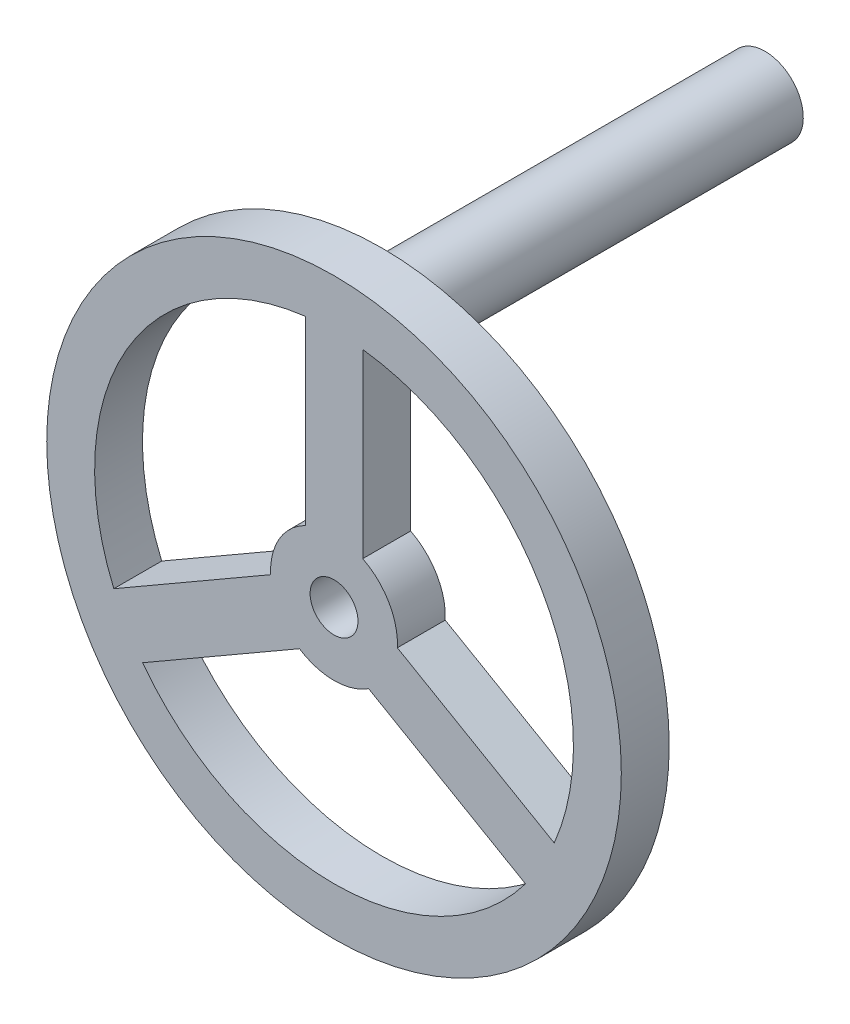
ISO-10303-21;
HEADER;
FILE_DESCRIPTION(('STEP AP214'),'2;1');
FILE_NAME('part.step','',(''),(''),'','','');
FILE_SCHEMA(('AUTOMOTIVE_DESIGN { 1 0 10303 214 1 1 1 1 }'));
ENDSEC;
DATA;
#1=APPLICATION_CONTEXT('core data for automotive mechanical design processes');
#2=APPLICATION_PROTOCOL_DEFINITION('international standard','automotive_design',2000,#1);
#3=PRODUCT_CONTEXT('',#1,'mechanical');
#4=PRODUCT('Part','Part','',(#3));
#5=PRODUCT_RELATED_PRODUCT_CATEGORY('part','',(#4));
#6=PRODUCT_DEFINITION_FORMATION('','',#4);
#7=PRODUCT_DEFINITION_CONTEXT('part definition',#1,'design');
#8=PRODUCT_DEFINITION('design','',#6,#7);
#9=PRODUCT_DEFINITION_SHAPE('','',#8);
#10=(LENGTH_UNIT() NAMED_UNIT(*) SI_UNIT(.MILLI.,.METRE.));
#11=(NAMED_UNIT(*) PLANE_ANGLE_UNIT() SI_UNIT($,.RADIAN.));
#12=(NAMED_UNIT(*) SI_UNIT($,.STERADIAN.) SOLID_ANGLE_UNIT());
#13=UNCERTAINTY_MEASURE_WITH_UNIT(LENGTH_MEASURE(1.E-05),#10,'distance_accuracy_value','');
#14=(GEOMETRIC_REPRESENTATION_CONTEXT(3) GLOBAL_UNCERTAINTY_ASSIGNED_CONTEXT((#13)) GLOBAL_UNIT_ASSIGNED_CONTEXT((#10,
#11,#12)) REPRESENTATION_CONTEXT('',''));
#15=CARTESIAN_POINT('',(0.,0.,0.));
#16=DIRECTION('',(0.,0.,1.));
#17=DIRECTION('',(1.,0.,0.));
#18=AXIS2_PLACEMENT_3D('',#15,#16,#17);
#19=CARTESIAN_POINT('',(-7.61999999999999,0.,12.7));
#20=DIRECTION('',(1.,0.,0.));
#21=DIRECTION('',(0.,1.,0.));
#22=AXIS2_PLACEMENT_3D('',#19,#20,#21);
#23=PLANE('',#22);
#24=DIRECTION('',(0.,-1.,0.));
#25=VECTOR('',#24,1.);
#26=CARTESIAN_POINT('',(-7.61999999999999,0.,0.));
#27=LINE('',#26,#25);
#28=CARTESIAN_POINT('',(-7.62,63.0411421216336,0.));
#29=VERTEX_POINT('',#28);
#30=CARTESIAN_POINT('',(-7.62,53.7076204865541,0.));
#31=VERTEX_POINT('',#30);
#32=EDGE_CURVE('E139',#29,#31,#27,.T.);
#33=ORIENTED_EDGE('',*,*,#32,.T.);
#34=CARTESIAN_POINT('',(-7.61999999999999,14.9905636945059,0.));
#35=VERTEX_POINT('',#34);
#36=EDGE_CURVE('E141',#31,#35,#27,.T.);
#37=ORIENTED_EDGE('',*,*,#36,.T.);
#38=DIRECTION('',(0.,0.,-1.));
#39=VECTOR('',#38,1.);
#40=CARTESIAN_POINT('',(-7.61999999999999,14.9905636945059,12.7));
#41=LINE('',#40,#39);
#42=CARTESIAN_POINT('',(-7.61999999999999,14.9905636945059,12.7));
#43=VERTEX_POINT('',#42);
#44=EDGE_CURVE('E46',#43,#35,#41,.T.);
#45=ORIENTED_EDGE('',*,*,#44,.F.);
#46=DIRECTION('',(0.,-1.,0.));
#47=VECTOR('',#46,1.);
#48=CARTESIAN_POINT('',(-7.61999999999999,0.,12.7));
#49=LINE('',#48,#47);
#50=CARTESIAN_POINT('',(-7.62,63.0411421216336,12.7));
#51=VERTEX_POINT('',#50);
#52=EDGE_CURVE('E193',#51,#43,#49,.T.);
#53=ORIENTED_EDGE('',*,*,#52,.F.);
#54=DIRECTION('',(0.,0.,-1.));
#55=VECTOR('',#54,1.);
#56=CARTESIAN_POINT('',(-7.62,63.0411421216336,12.7));
#57=LINE('',#56,#55);
#58=EDGE_CURVE('E144',#51,#29,#57,.T.);
#59=ORIENTED_EDGE('',*,*,#58,.T.);
#60=EDGE_LOOP('',(#33,#37,#45,#53,#59));
#61=FACE_BOUND('',#60,.T.);
#62=ADVANCED_FACE('F37',(#61),#23,.F.);
#63=CARTESIAN_POINT('',(0.,0.,12.7));
#64=DIRECTION('',(0.,0.,-1.));
#65=DIRECTION('',(-1.,0.,0.));
#66=AXIS2_PLACEMENT_3D('',#63,#64,#65);
#67=CYLINDRICAL_SURFACE('',#66,16.8161053719058);
#68=CARTESIAN_POINT('',(0.,0.,0.));
#69=DIRECTION('',(0.,0.,1.));
#70=DIRECTION('',(1.,0.,0.));
#71=AXIS2_PLACEMENT_3D('',#68,#69,#70);
#72=CIRCLE('',#71,16.8161053719058);
#73=CARTESIAN_POINT('',(-16.7922089764898,-0.89616827041572,0.));
#74=VERTEX_POINT('',#73);
#75=EDGE_CURVE('E149',#35,#74,#72,.T.);
#76=ORIENTED_EDGE('',*,*,#75,.T.);
#77=DIRECTION('',(0.,0.,-1.));
#78=VECTOR('',#77,1.);
#79=CARTESIAN_POINT('',(-16.7922089764898,-0.89616827041572,12.7));
#80=LINE('',#79,#78);
#81=CARTESIAN_POINT('',(-16.7922089764898,-0.89616827041572,12.7));
#82=VERTEX_POINT('',#81);
#83=EDGE_CURVE('E238',#82,#74,#80,.T.);
#84=ORIENTED_EDGE('',*,*,#83,.F.);
#85=CARTESIAN_POINT('',(0.,0.,12.7));
#86=DIRECTION('',(0.,0.,1.));
#87=DIRECTION('',(1.,0.,0.));
#88=AXIS2_PLACEMENT_3D('',#85,#86,#87);
#89=CIRCLE('',#88,16.8161053719058);
#90=EDGE_CURVE('E178',#43,#82,#89,.T.);
#91=ORIENTED_EDGE('',*,*,#90,.F.);
#92=ORIENTED_EDGE('',*,*,#44,.T.);
#93=EDGE_LOOP('',(#76,#84,#91,#92));
#94=FACE_BOUND('',#93,.T.);
#95=ADVANCED_FACE('F276',(#94),#67,.T.);
#96=CARTESIAN_POINT('',(-3.80999999999944,6.59911357683644,12.7));
#97=DIRECTION('',(-0.500000000000001,0.866025403784438,0.));
#98=DIRECTION('',(-0.866025403784438,-0.500000000000001,0.));
#99=AXIS2_PLACEMENT_3D('',#96,#97,#98);
#100=PLANE('',#99);
#101=DIRECTION('',(0.866025403784438,0.500000000000001,0.));
#102=VECTOR('',#101,1.);
#103=CARTESIAN_POINT('',(-3.80999999999944,6.59911357683644,0.));
#104=LINE('',#103,#102);
#105=CARTESIAN_POINT('',(-58.4052305609187,-24.9214574839799,0.));
#106=VERTEX_POINT('',#105);
#107=EDGE_CURVE('E226',#106,#74,#104,.T.);
#108=ORIENTED_EDGE('',*,*,#107,.F.);
#109=DIRECTION('',(0.,0.,-1.));
#110=VECTOR('',#109,1.);
#111=CARTESIAN_POINT('',(-58.4052305609187,-24.9214574839799,12.7));
#112=LINE('',#111,#110);
#113=CARTESIAN_POINT('',(-58.4052305609187,-24.9214574839799,12.7));
#114=VERTEX_POINT('',#113);
#115=EDGE_CURVE('E234',#114,#106,#112,.T.);
#116=ORIENTED_EDGE('',*,*,#115,.F.);
#117=DIRECTION('',(0.866025403784438,0.500000000000001,0.));
#118=VECTOR('',#117,1.);
#119=CARTESIAN_POINT('',(-3.80999999999944,6.59911357683644,12.7));
#120=LINE('',#119,#118);
#121=EDGE_CURVE('E196',#114,#82,#120,.T.);
#122=ORIENTED_EDGE('',*,*,#121,.T.);
#123=ORIENTED_EDGE('',*,*,#83,.T.);
#124=EDGE_LOOP('',(#108,#116,#122,#123));
#125=FACE_BOUND('',#124,.T.);
#126=ADVANCED_FACE('F273',(#125),#100,.T.);
#127=CARTESIAN_POINT('',(3.81000000000057,-6.5991135768384,12.7));
#128=DIRECTION('',(-0.500000000000001,0.866025403784438,0.));
#129=DIRECTION('',(-0.866025403784438,-0.500000000000001,0.));
#130=AXIS2_PLACEMENT_3D('',#127,#128,#129);
#131=PLANE('',#130);
#132=DIRECTION('',(0.866025403784438,0.500000000000001,0.));
#133=VECTOR('',#132,1.);
#134=CARTESIAN_POINT('',(3.81000000000057,-6.5991135768384,0.));
#135=LINE('',#134,#133);
#136=CARTESIAN_POINT('',(-50.7852305609184,-38.1196846376548,0.));
#137=VERTEX_POINT('',#136);
#138=CARTESIAN_POINT('',(-9.17220897648904,-14.0943954240909,0.));
#139=VERTEX_POINT('',#138);
#140=EDGE_CURVE('E219',#137,#139,#135,.T.);
#141=ORIENTED_EDGE('',*,*,#140,.T.);
#142=DIRECTION('',(0.,0.,-1.));
#143=VECTOR('',#142,1.);
#144=CARTESIAN_POINT('',(-9.17220897648904,-14.0943954240909,12.7));
#145=LINE('',#144,#143);
#146=CARTESIAN_POINT('',(-9.17220897648904,-14.0943954240909,12.7));
#147=VERTEX_POINT('',#146);
#148=EDGE_CURVE('E235',#147,#139,#145,.T.);
#149=ORIENTED_EDGE('',*,*,#148,.F.);
#150=DIRECTION('',(0.866025403784438,0.500000000000001,0.));
#151=VECTOR('',#150,1.);
#152=CARTESIAN_POINT('',(3.81000000000057,-6.5991135768384,12.7));
#153=LINE('',#152,#151);
#154=CARTESIAN_POINT('',(-50.7852305609184,-38.1196846376548,12.7));
#155=VERTEX_POINT('',#154);
#156=EDGE_CURVE('E185',#155,#147,#153,.T.);
#157=ORIENTED_EDGE('',*,*,#156,.F.);
#158=DIRECTION('',(0.,0.,-1.));
#159=VECTOR('',#158,1.);
#160=CARTESIAN_POINT('',(-50.7852305609184,-38.1196846376548,12.7));
#161=LINE('',#160,#159);
#162=EDGE_CURVE('E241',#155,#137,#161,.T.);
#163=ORIENTED_EDGE('',*,*,#162,.T.);
#164=EDGE_LOOP('',(#141,#149,#157,#163));
#165=FACE_BOUND('',#164,.T.);
#166=ADVANCED_FACE('F299',(#165),#131,.F.);
#167=CARTESIAN_POINT('',(9.17220897649218,-14.094395424089,0.));
#168=VERTEX_POINT('',#167);
#169=EDGE_CURVE('E213',#139,#168,#72,.T.);
#170=ORIENTED_EDGE('',*,*,#169,.T.);
#171=DIRECTION('',(0.,0.,-1.));
#172=VECTOR('',#171,1.);
#173=CARTESIAN_POINT('',(9.17220897649218,-14.094395424089,12.7));
#174=LINE('',#173,#172);
#175=CARTESIAN_POINT('',(9.17220897649218,-14.094395424089,12.7));
#176=VERTEX_POINT('',#175);
#177=EDGE_CURVE('E245',#176,#168,#174,.T.);
#178=ORIENTED_EDGE('',*,*,#177,.F.);
#179=EDGE_CURVE('E179',#147,#176,#89,.T.);
#180=ORIENTED_EDGE('',*,*,#179,.F.);
#181=ORIENTED_EDGE('',*,*,#148,.T.);
#182=EDGE_LOOP('',(#170,#178,#180,#181));
#183=FACE_BOUND('',#182,.T.);
#184=ADVANCED_FACE('F280',(#183),#67,.T.);
#185=CARTESIAN_POINT('',(-3.80999999999897,-6.59911357683565,12.7));
#186=DIRECTION('',(-0.5,-0.866025403784439,0.));
#187=DIRECTION('',(0.866025403784439,-0.5,0.));
#188=AXIS2_PLACEMENT_3D('',#185,#186,#187);
#189=PLANE('',#188);
#190=DIRECTION('',(-0.866025403784439,0.5,0.));
#191=VECTOR('',#190,1.);
#192=CARTESIAN_POINT('',(-3.80999999999897,-6.59911357683565,0.));
#193=LINE('',#192,#191);
#194=CARTESIAN_POINT('',(50.7852305609211,-38.1196846376525,0.));
#195=VERTEX_POINT('',#194);
#196=EDGE_CURVE('E223',#195,#168,#193,.T.);
#197=ORIENTED_EDGE('',*,*,#196,.F.);
#198=DIRECTION('',(0.,0.,-1.));
#199=VECTOR('',#198,1.);
#200=CARTESIAN_POINT('',(50.7852305609211,-38.1196846376525,12.7));
#201=LINE('',#200,#199);
#202=CARTESIAN_POINT('',(50.7852305609211,-38.1196846376525,12.7));
#203=VERTEX_POINT('',#202);
#204=EDGE_CURVE('E243',#203,#195,#201,.T.);
#205=ORIENTED_EDGE('',*,*,#204,.F.);
#206=DIRECTION('',(-0.866025403784439,0.5,0.));
#207=VECTOR('',#206,1.);
#208=CARTESIAN_POINT('',(-3.80999999999897,-6.59911357683565,12.7));
#209=LINE('',#208,#207);
#210=EDGE_CURVE('E190',#203,#176,#209,.T.);
#211=ORIENTED_EDGE('',*,*,#210,.T.);
#212=ORIENTED_EDGE('',*,*,#177,.T.);
#213=EDGE_LOOP('',(#197,#205,#211,#212));
#214=FACE_BOUND('',#213,.T.);
#215=ADVANCED_FACE('F288',(#214),#189,.T.);
#216=CARTESIAN_POINT('',(3.81000000000102,6.59911357683919,12.7));
#217=DIRECTION('',(-0.5,-0.866025403784439,0.));
#218=DIRECTION('',(0.866025403784439,-0.5,0.));
#219=AXIS2_PLACEMENT_3D('',#216,#217,#218);
#220=PLANE('',#219);
#221=DIRECTION('',(-0.866025403784439,0.5,0.));
#222=VECTOR('',#221,1.);
#223=CARTESIAN_POINT('',(3.81000000000102,6.59911357683919,0.));
#224=LINE('',#223,#222);
#225=CARTESIAN_POINT('',(58.4052305609209,-24.9214574839776,0.));
#226=VERTEX_POINT('',#225);
#227=CARTESIAN_POINT('',(16.7922089764914,-0.896168270413794,0.));
#228=VERTEX_POINT('',#227);
#229=EDGE_CURVE('E206',#226,#228,#224,.T.);
#230=ORIENTED_EDGE('',*,*,#229,.T.);
#231=DIRECTION('',(0.,0.,-1.));
#232=VECTOR('',#231,1.);
#233=CARTESIAN_POINT('',(16.7922089764914,-0.896168270413794,12.7));
#234=LINE('',#233,#232);
#235=CARTESIAN_POINT('',(16.7922089764914,-0.896168270413794,12.7));
#236=VERTEX_POINT('',#235);
#237=EDGE_CURVE('E41',#236,#228,#234,.T.);
#238=ORIENTED_EDGE('',*,*,#237,.F.);
#239=DIRECTION('',(-0.866025403784439,0.5,0.));
#240=VECTOR('',#239,1.);
#241=CARTESIAN_POINT('',(3.81000000000102,6.59911357683919,12.7));
#242=LINE('',#241,#240);
#243=CARTESIAN_POINT('',(58.4052305609209,-24.9214574839776,12.7));
#244=VERTEX_POINT('',#243);
#245=EDGE_CURVE('E171',#244,#236,#242,.T.);
#246=ORIENTED_EDGE('',*,*,#245,.F.);
#247=DIRECTION('',(0.,0.,-1.));
#248=VECTOR('',#247,1.);
#249=CARTESIAN_POINT('',(58.4052305609209,-24.9214574839776,12.7));
#250=LINE('',#249,#248);
#251=EDGE_CURVE('E205',#244,#226,#250,.T.);
#252=ORIENTED_EDGE('',*,*,#251,.T.);
#253=EDGE_LOOP('',(#230,#238,#246,#252));
#254=FACE_BOUND('',#253,.T.);
#255=ADVANCED_FACE('F39',(#254),#220,.F.);
#256=CARTESIAN_POINT('',(7.62000000000001,14.9905636945059,0.));
#257=VERTEX_POINT('',#256);
#258=EDGE_CURVE('E209',#228,#257,#72,.T.);
#259=ORIENTED_EDGE('',*,*,#258,.T.);
#260=DIRECTION('',(0.,0.,-1.));
#261=VECTOR('',#260,1.);
#262=CARTESIAN_POINT('',(7.62000000000001,14.9905636945059,12.7));
#263=LINE('',#262,#261);
#264=CARTESIAN_POINT('',(7.62000000000001,14.9905636945059,12.7));
#265=VERTEX_POINT('',#264);
#266=EDGE_CURVE('E251',#265,#257,#263,.T.);
#267=ORIENTED_EDGE('',*,*,#266,.F.);
#268=EDGE_CURVE('E174',#236,#265,#89,.T.);
#269=ORIENTED_EDGE('',*,*,#268,.F.);
#270=ORIENTED_EDGE('',*,*,#237,.T.);
#271=EDGE_LOOP('',(#259,#267,#269,#270));
#272=FACE_BOUND('',#271,.T.);
#273=ADVANCED_FACE('F258',(#272),#67,.T.);
#274=CARTESIAN_POINT('',(7.62000000000001,0.,12.7));
#275=DIRECTION('',(1.,0.,0.));
#276=DIRECTION('',(0.,1.,0.));
#277=AXIS2_PLACEMENT_3D('',#274,#275,#276);
#278=PLANE('',#277);
#279=DIRECTION('',(0.,-1.,0.));
#280=VECTOR('',#279,1.);
#281=CARTESIAN_POINT('',(7.62000000000001,0.,0.));
#282=LINE('',#281,#280);
#283=CARTESIAN_POINT('',(7.62,63.0411421216335,0.));
#284=VERTEX_POINT('',#283);
#285=CARTESIAN_POINT('',(7.62,53.7076204865541,0.));
#286=VERTEX_POINT('',#285);
#287=EDGE_CURVE('E214',#284,#286,#282,.T.);
#288=ORIENTED_EDGE('',*,*,#287,.F.);
#289=DIRECTION('',(0.,0.,-1.));
#290=VECTOR('',#289,1.);
#291=CARTESIAN_POINT('',(7.62,63.0411421216335,12.7));
#292=LINE('',#291,#290);
#293=CARTESIAN_POINT('',(7.62,63.0411421216335,12.7));
#294=VERTEX_POINT('',#293);
#295=EDGE_CURVE('E250',#294,#284,#292,.T.);
#296=ORIENTED_EDGE('',*,*,#295,.F.);
#297=DIRECTION('',(0.,-1.,0.));
#298=VECTOR('',#297,1.);
#299=CARTESIAN_POINT('',(7.62000000000001,0.,12.7));
#300=LINE('',#299,#298);
#301=EDGE_CURVE('E177',#294,#265,#300,.T.);
#302=ORIENTED_EDGE('',*,*,#301,.T.);
#303=ORIENTED_EDGE('',*,*,#266,.T.);
#304=EDGE_CURVE('E212',#286,#257,#282,.T.);
#305=ORIENTED_EDGE('',*,*,#304,.F.);
#306=EDGE_LOOP('',(#288,#296,#302,#303,#305));
#307=FACE_BOUND('',#306,.T.);
#308=ADVANCED_FACE('F321',(#307),#278,.T.);
#309=CARTESIAN_POINT('',(0.,0.,12.7));
#310=DIRECTION('',(0.,0.,-1.));
#311=DIRECTION('',(-1.,0.,0.));
#312=AXIS2_PLACEMENT_3D('',#309,#310,#311);
#313=CYLINDRICAL_SURFACE('',#312,76.2);
#314=CARTESIAN_POINT('',(0.,0.,12.7));
#315=DIRECTION('',(0.,0.,1.));
#316=DIRECTION('',(1.,0.,0.));
#317=AXIS2_PLACEMENT_3D('',#314,#315,#316);
#318=CIRCLE('',#317,76.2);
#319=CARTESIAN_POINT('',(76.2,0.,12.7));
#320=VERTEX_POINT('',#319);
#321=EDGE_CURVE('E199',#320,#320,#318,.T.);
#322=ORIENTED_EDGE('',*,*,#321,.F.);
#323=EDGE_LOOP('',(#322));
#324=FACE_BOUND('',#323,.T.);
#325=CARTESIAN_POINT('',(0.,0.,0.));
#326=DIRECTION('',(0.,0.,1.));
#327=DIRECTION('',(1.,0.,0.));
#328=AXIS2_PLACEMENT_3D('',#325,#326,#327);
#329=CIRCLE('',#328,76.2);
#330=CARTESIAN_POINT('',(76.2,0.,0.));
#331=VERTEX_POINT('',#330);
#332=EDGE_CURVE('E228',#331,#331,#329,.T.);
#333=ORIENTED_EDGE('',*,*,#332,.T.);
#334=EDGE_LOOP('',(#333));
#335=FACE_BOUND('',#334,.T.);
#336=ADVANCED_FACE('F325',(#324,#335),#313,.T.);
#337=CARTESIAN_POINT('',(0.,0.,12.7));
#338=DIRECTION('',(0.,0.,-1.));
#339=DIRECTION('',(-1.,0.,0.));
#340=AXIS2_PLACEMENT_3D('',#337,#338,#339);
#341=CYLINDRICAL_SURFACE('',#340,63.5);
#342=CARTESIAN_POINT('',(0.,0.,0.));
#343=DIRECTION('',(0.,0.,1.));
#344=DIRECTION('',(1.,0.,0.));
#345=AXIS2_PLACEMENT_3D('',#342,#343,#344);
#346=CIRCLE('',#345,63.5);
#347=CARTESIAN_POINT('',(-9.89713726788057,62.7239720832532,0.));
#348=VERTEX_POINT('',#347);
#349=EDGE_CURVE('E160',#29,#348,#346,.T.);
#350=ORIENTED_EDGE('',*,*,#349,.F.);
#351=ORIENTED_EDGE('',*,*,#58,.F.);
#352=CARTESIAN_POINT('',(0.,0.,12.7));
#353=DIRECTION('',(0.,0.,1.));
#354=DIRECTION('',(1.,0.,0.));
#355=AXIS2_PLACEMENT_3D('',#352,#353,#354);
#356=CIRCLE('',#355,63.5);
#357=EDGE_CURVE('E186',#51,#114,#356,.T.);
#358=ORIENTED_EDGE('',*,*,#357,.T.);
#359=ORIENTED_EDGE('',*,*,#115,.T.);
#360=EDGE_CURVE('E220',#348,#106,#346,.T.);
#361=ORIENTED_EDGE('',*,*,#360,.F.);
#362=EDGE_LOOP('',(#350,#351,#358,#359,#361));
#363=FACE_BOUND('',#362,.T.);
#364=ADVANCED_FACE('F269',(#363),#341,.F.);
#365=EDGE_CURVE('E156',#137,#195,#346,.T.);
#366=ORIENTED_EDGE('',*,*,#365,.F.);
#367=ORIENTED_EDGE('',*,*,#162,.F.);
#368=EDGE_CURVE('E187',#155,#203,#356,.T.);
#369=ORIENTED_EDGE('',*,*,#368,.T.);
#370=ORIENTED_EDGE('',*,*,#204,.T.);
#371=EDGE_LOOP('',(#366,#367,#369,#370));
#372=FACE_BOUND('',#371,.T.);
#373=ADVANCED_FACE('F296',(#372),#341,.F.);
#374=CARTESIAN_POINT('',(9.89713726788057,62.7239720832532,0.));
#375=VERTEX_POINT('',#374);
#376=EDGE_CURVE('E217',#226,#375,#346,.T.);
#377=ORIENTED_EDGE('',*,*,#376,.F.);
#378=ORIENTED_EDGE('',*,*,#251,.F.);
#379=EDGE_CURVE('E182',#244,#294,#356,.T.);
#380=ORIENTED_EDGE('',*,*,#379,.T.);
#381=ORIENTED_EDGE('',*,*,#295,.T.);
#382=EDGE_CURVE('E216',#375,#284,#346,.T.);
#383=ORIENTED_EDGE('',*,*,#382,.F.);
#384=EDGE_LOOP('',(#377,#378,#380,#381,#383));
#385=FACE_BOUND('',#384,.T.);
#386=ADVANCED_FACE('F264',(#385),#341,.F.);
#387=CARTESIAN_POINT('',(0.,0.,12.7));
#388=DIRECTION('',(0.,0.,-1.));
#389=DIRECTION('',(-1.,0.,0.));
#390=AXIS2_PLACEMENT_3D('',#387,#388,#389);
#391=CYLINDRICAL_SURFACE('',#390,6.35);
#392=CARTESIAN_POINT('',(0.,0.,12.7));
#393=DIRECTION('',(0.,0.,1.));
#394=DIRECTION('',(1.,0.,0.));
#395=AXIS2_PLACEMENT_3D('',#392,#393,#394);
#396=CIRCLE('',#395,6.35);
#397=CARTESIAN_POINT('',(6.35,0.,12.7));
#398=VERTEX_POINT('',#397);
#399=EDGE_CURVE('E202',#398,#398,#396,.T.);
#400=ORIENTED_EDGE('',*,*,#399,.T.);
#401=EDGE_LOOP('',(#400));
#402=FACE_BOUND('',#401,.T.);
#403=CARTESIAN_POINT('',(0.,0.,0.));
#404=DIRECTION('',(0.,0.,1.));
#405=DIRECTION('',(1.,0.,0.));
#406=AXIS2_PLACEMENT_3D('',#403,#404,#405);
#407=CIRCLE('',#406,6.35);
#408=CARTESIAN_POINT('',(6.35,0.,0.));
#409=VERTEX_POINT('',#408);
#410=EDGE_CURVE('E175',#409,#409,#407,.T.);
#411=ORIENTED_EDGE('',*,*,#410,.F.);
#412=EDGE_LOOP('',(#411));
#413=FACE_BOUND('',#412,.T.);
#414=ADVANCED_FACE('F380',(#402,#413),#391,.F.);
#415=CARTESIAN_POINT('',(0.,0.,12.7));
#416=DIRECTION('',(0.,0.,1.));
#417=DIRECTION('',(1.,0.,0.));
#418=AXIS2_PLACEMENT_3D('',#415,#416,#417);
#419=PLANE('',#418);
#420=ORIENTED_EDGE('',*,*,#245,.T.);
#421=ORIENTED_EDGE('',*,*,#268,.T.);
#422=ORIENTED_EDGE('',*,*,#301,.F.);
#423=ORIENTED_EDGE('',*,*,#379,.F.);
#424=EDGE_LOOP('',(#420,#421,#422,#423));
#425=FACE_BOUND('',#424,.T.);
#426=ORIENTED_EDGE('',*,*,#156,.T.);
#427=ORIENTED_EDGE('',*,*,#179,.T.);
#428=ORIENTED_EDGE('',*,*,#210,.F.);
#429=ORIENTED_EDGE('',*,*,#368,.F.);
#430=EDGE_LOOP('',(#426,#427,#428,#429));
#431=FACE_BOUND('',#430,.T.);
#432=ORIENTED_EDGE('',*,*,#52,.T.);
#433=ORIENTED_EDGE('',*,*,#90,.T.);
#434=ORIENTED_EDGE('',*,*,#121,.F.);
#435=ORIENTED_EDGE('',*,*,#357,.F.);
#436=EDGE_LOOP('',(#432,#433,#434,#435));
#437=FACE_BOUND('',#436,.T.);
#438=ORIENTED_EDGE('',*,*,#321,.T.);
#439=EDGE_LOOP('',(#438));
#440=FACE_BOUND('',#439,.T.);
#441=ORIENTED_EDGE('',*,*,#399,.F.);
#442=EDGE_LOOP('',(#441));
#443=FACE_BOUND('',#442,.T.);
#444=ADVANCED_FACE('F293',(#425,#431,#437,#440,#443),#419,.T.);
#445=CARTESIAN_POINT('',(0.,0.,0.));
#446=DIRECTION('',(0.,0.,1.));
#447=DIRECTION('',(1.,0.,0.));
#448=AXIS2_PLACEMENT_3D('',#445,#446,#447);
#449=PLANE('',#448);
#450=CARTESIAN_POINT('',(0.,60.4278288166582,0.));
#451=DIRECTION('',(0.,0.,-1.));
#452=DIRECTION('',(-1.,0.,0.));
#453=AXIS2_PLACEMENT_3D('',#450,#451,#452);
#454=CIRCLE('',#453,10.16);
#455=EDGE_CURVE('E48',#348,#375,#454,.T.);
#456=ORIENTED_EDGE('',*,*,#455,.F.);
#457=ORIENTED_EDGE('',*,*,#360,.T.);
#458=ORIENTED_EDGE('',*,*,#107,.T.);
#459=ORIENTED_EDGE('',*,*,#75,.F.);
#460=ORIENTED_EDGE('',*,*,#36,.F.);
#461=EDGE_CURVE('E11',#286,#31,#454,.T.);
#462=ORIENTED_EDGE('',*,*,#461,.F.);
#463=ORIENTED_EDGE('',*,*,#304,.T.);
#464=ORIENTED_EDGE('',*,*,#258,.F.);
#465=ORIENTED_EDGE('',*,*,#229,.F.);
#466=ORIENTED_EDGE('',*,*,#376,.T.);
#467=EDGE_LOOP('',(#456,#457,#458,#459,#460,#462,#463,#464,#465,#466));
#468=FACE_BOUND('',#467,.T.);
#469=ORIENTED_EDGE('',*,*,#140,.F.);
#470=ORIENTED_EDGE('',*,*,#365,.T.);
#471=ORIENTED_EDGE('',*,*,#196,.T.);
#472=ORIENTED_EDGE('',*,*,#169,.F.);
#473=EDGE_LOOP('',(#469,#470,#471,#472));
#474=FACE_BOUND('',#473,.T.);
#475=ORIENTED_EDGE('',*,*,#332,.F.);
#476=EDGE_LOOP('',(#475));
#477=FACE_BOUND('',#476,.T.);
#478=ORIENTED_EDGE('',*,*,#410,.T.);
#479=EDGE_LOOP('',(#478));
#480=FACE_BOUND('',#479,.T.);
#481=ADVANCED_FACE('F151',(#468,#474,#477,#480),#449,.F.);
#482=CARTESIAN_POINT('',(0.,60.4278288166582,0.));
#483=DIRECTION('',(0.,0.,-1.));
#484=DIRECTION('',(-1.,0.,0.));
#485=AXIS2_PLACEMENT_3D('',#482,#483,#484);
#486=PLANE('',#485);
#487=EDGE_CURVE('E49',#375,#286,#454,.T.);
#488=ORIENTED_EDGE('',*,*,#487,.F.);
#489=ORIENTED_EDGE('',*,*,#382,.T.);
#490=ORIENTED_EDGE('',*,*,#287,.T.);
#491=EDGE_LOOP('',(#488,#489,#490));
#492=FACE_BOUND('',#491,.T.);
#493=ADVANCED_FACE('F332',(#492),#486,.F.);
#494=CARTESIAN_POINT('',(0.,60.4278288166582,-101.6));
#495=DIRECTION('',(0.,0.,1.));
#496=DIRECTION('',(1.,0.,0.));
#497=AXIS2_PLACEMENT_3D('',#494,#495,#496);
#498=CYLINDRICAL_SURFACE('',#497,10.16);
#499=CARTESIAN_POINT('',(0.,60.4278288166582,-101.6));
#500=DIRECTION('',(0.,0.,-1.));
#501=DIRECTION('',(-1.,0.,0.));
#502=AXIS2_PLACEMENT_3D('',#499,#500,#501);
#503=CIRCLE('',#502,10.16);
#504=CARTESIAN_POINT('',(-10.16,60.4278288166582,-101.6));
#505=VERTEX_POINT('',#504);
#506=EDGE_CURVE('E168',#505,#505,#503,.T.);
#507=ORIENTED_EDGE('',*,*,#506,.F.);
#508=EDGE_LOOP('',(#507));
#509=FACE_BOUND('',#508,.T.);
#510=ORIENTED_EDGE('',*,*,#455,.T.);
#511=ORIENTED_EDGE('',*,*,#487,.T.);
#512=ORIENTED_EDGE('',*,*,#461,.T.);
#513=EDGE_CURVE('E158',#31,#348,#454,.T.);
#514=ORIENTED_EDGE('',*,*,#513,.T.);
#515=EDGE_LOOP('',(#510,#511,#512,#514));
#516=FACE_BOUND('',#515,.T.);
#517=ADVANCED_FACE('F163',(#509,#516),#498,.T.);
#518=CARTESIAN_POINT('',(0.,60.4278288166582,-101.6));
#519=DIRECTION('',(0.,0.,-1.));
#520=DIRECTION('',(-1.,0.,0.));
#521=AXIS2_PLACEMENT_3D('',#518,#519,#520);
#522=PLANE('',#521);
#523=ORIENTED_EDGE('',*,*,#506,.T.);
#524=EDGE_LOOP('',(#523));
#525=FACE_BOUND('',#524,.T.);
#526=ADVANCED_FACE('F339',(#525),#522,.T.);
#527=ORIENTED_EDGE('',*,*,#32,.F.);
#528=ORIENTED_EDGE('',*,*,#349,.T.);
#529=ORIENTED_EDGE('',*,*,#513,.F.);
#530=EDGE_LOOP('',(#527,#528,#529));
#531=FACE_BOUND('',#530,.T.);
#532=ADVANCED_FACE('F159',(#531),#486,.F.);
#533=CLOSED_SHELL('',(#62,#95,#126,#166,#184,#215,#255,#273,#308,#336,#364,#373,#386,#414,#444,
#481,#493,#517,#526,#532));
#534=MANIFOLD_SOLID_BREP('B2',#533);
#535=ADVANCED_BREP_SHAPE_REPRESENTATION('',(#18,#534),#14);
#536=SHAPE_DEFINITION_REPRESENTATION(#9,#535);
ENDSEC;
END-ISO-10303-21;
